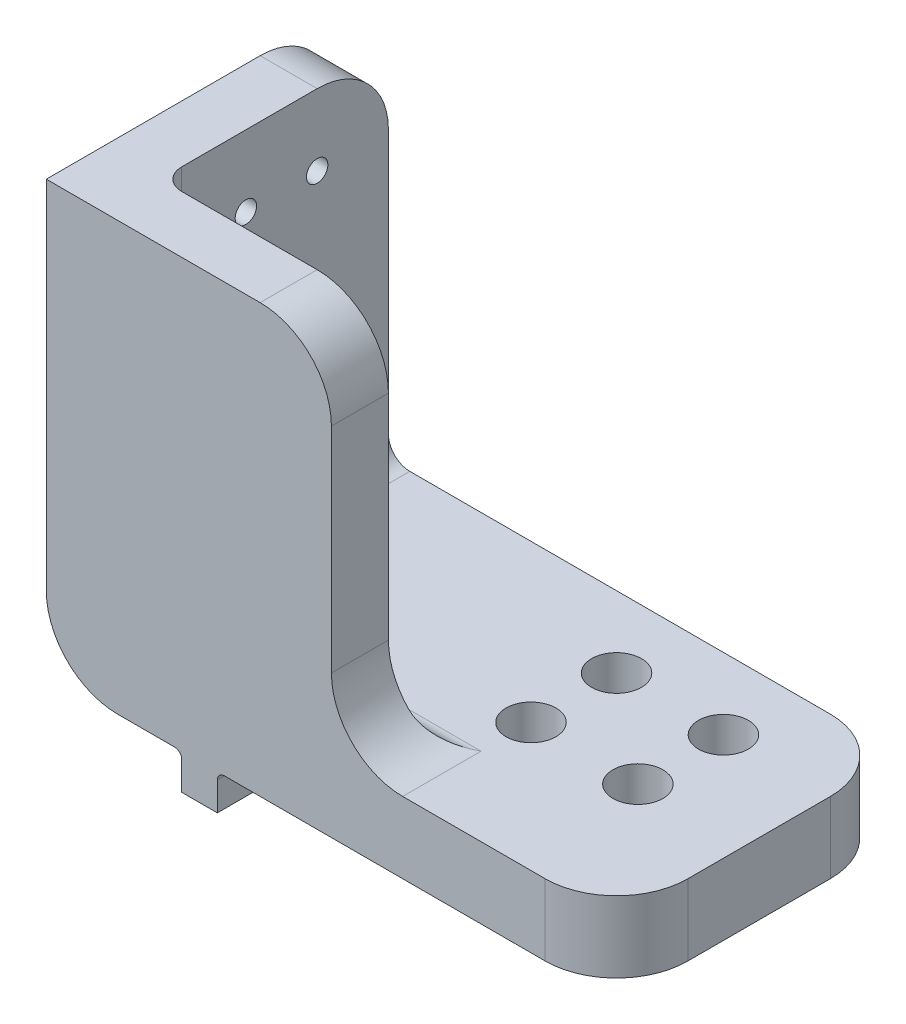
ISO-10303-21;
HEADER;
FILE_DESCRIPTION(('STEP AP214'),'2;1');
FILE_NAME('part.step','',(''),(''),'','','');
FILE_SCHEMA(('AUTOMOTIVE_DESIGN { 1 0 10303 214 1 1 1 1 }'));
ENDSEC;
DATA;
#1=APPLICATION_CONTEXT('core data for automotive mechanical design processes');
#2=APPLICATION_PROTOCOL_DEFINITION('international standard','automotive_design',2000,#1);
#3=PRODUCT_CONTEXT('',#1,'mechanical');
#4=PRODUCT('Part','Part','',(#3));
#5=PRODUCT_RELATED_PRODUCT_CATEGORY('part','',(#4));
#6=PRODUCT_DEFINITION_FORMATION('','',#4);
#7=PRODUCT_DEFINITION_CONTEXT('part definition',#1,'design');
#8=PRODUCT_DEFINITION('design','',#6,#7);
#9=PRODUCT_DEFINITION_SHAPE('','',#8);
#10=(LENGTH_UNIT() NAMED_UNIT(*) SI_UNIT(.MILLI.,.METRE.));
#11=(NAMED_UNIT(*) PLANE_ANGLE_UNIT() SI_UNIT($,.RADIAN.));
#12=(NAMED_UNIT(*) SI_UNIT($,.STERADIAN.) SOLID_ANGLE_UNIT());
#13=UNCERTAINTY_MEASURE_WITH_UNIT(LENGTH_MEASURE(1.E-05),#10,'distance_accuracy_value','');
#14=(GEOMETRIC_REPRESENTATION_CONTEXT(3) GLOBAL_UNCERTAINTY_ASSIGNED_CONTEXT((#13)) GLOBAL_UNIT_ASSIGNED_CONTEXT((#10,
#11,#12)) REPRESENTATION_CONTEXT('',''));
#15=CARTESIAN_POINT('',(0.,0.,0.));
#16=DIRECTION('',(0.,0.,1.));
#17=DIRECTION('',(1.,0.,0.));
#18=AXIS2_PLACEMENT_3D('',#15,#16,#17);
#19=CARTESIAN_POINT('',(0.,0.,0.));
#20=DIRECTION('',(0.,-1.,0.));
#21=DIRECTION('',(0.,0.,-1.));
#22=AXIS2_PLACEMENT_3D('',#19,#20,#21);
#23=PLANE('',#22);
#24=DIRECTION('',(-1.,0.,0.));
#25=VECTOR('',#24,1.);
#26=CARTESIAN_POINT('',(0.,0.,-40.));
#27=LINE('',#26,#25);
#28=CARTESIAN_POINT('',(18.,0.,-40.));
#29=VERTEX_POINT('',#28);
#30=CARTESIAN_POINT('',(10.,0.,-40.));
#31=VERTEX_POINT('',#30);
#32=EDGE_CURVE('E337',#29,#31,#27,.T.);
#33=ORIENTED_EDGE('',*,*,#32,.F.);
#34=DIRECTION('',(0.,0.,-1.));
#35=VECTOR('',#34,1.);
#36=CARTESIAN_POINT('',(18.,0.,0.));
#37=LINE('',#36,#35);
#38=CARTESIAN_POINT('',(18.,0.,0.));
#39=VERTEX_POINT('',#38);
#40=EDGE_CURVE('E69',#29,#39,#37,.F.);
#41=ORIENTED_EDGE('',*,*,#40,.T.);
#42=DIRECTION('',(1.,0.,0.));
#43=VECTOR('',#42,1.);
#44=CARTESIAN_POINT('',(0.,0.,0.));
#45=LINE('',#44,#43);
#46=CARTESIAN_POINT('',(10.,0.,0.));
#47=VERTEX_POINT('',#46);
#48=EDGE_CURVE('E330',#47,#39,#45,.T.);
#49=ORIENTED_EDGE('',*,*,#48,.F.);
#50=DIRECTION('',(0.,0.,1.));
#51=VECTOR('',#50,1.);
#52=CARTESIAN_POINT('',(10.,0.,-40.));
#53=LINE('',#52,#51);
#54=EDGE_CURVE('E563',#47,#31,#53,.F.);
#55=ORIENTED_EDGE('',*,*,#54,.T.);
#56=EDGE_LOOP('',(#33,#41,#49,#55));
#57=FACE_BOUND('',#56,.T.);
#58=ADVANCED_FACE('F51',(#57),#23,.T.);
#59=CARTESIAN_POINT('',(50.,0.,-18.));
#60=DIRECTION('',(0.,1.,0.));
#61=DIRECTION('',(0.,0.,1.));
#62=AXIS2_PLACEMENT_3D('',#59,#60,#61);
#63=CIRCLE('',#62,1.6);
#64=CARTESIAN_POINT('',(50.,0.,-16.4));
#65=VERTEX_POINT('',#64);
#66=EDGE_CURVE('E303',#65,#65,#63,.T.);
#67=ORIENTED_EDGE('',*,*,#66,.T.);
#68=EDGE_LOOP('',(#67));
#69=FACE_BOUND('',#68,.T.);
#70=CARTESIAN_POINT('',(65.,0.,-30.));
#71=DIRECTION('',(0.,1.,0.));
#72=DIRECTION('',(0.,0.,1.));
#73=AXIS2_PLACEMENT_3D('',#70,#71,#72);
#74=CIRCLE('',#73,1.6);
#75=CARTESIAN_POINT('',(65.,0.,-28.4));
#76=VERTEX_POINT('',#75);
#77=EDGE_CURVE('E311',#76,#76,#74,.T.);
#78=ORIENTED_EDGE('',*,*,#77,.T.);
#79=EDGE_LOOP('',(#78));
#80=FACE_BOUND('',#79,.T.);
#81=CARTESIAN_POINT('',(50.,0.,-30.));
#82=DIRECTION('',(0.,1.,0.));
#83=DIRECTION('',(0.,0.,1.));
#84=AXIS2_PLACEMENT_3D('',#81,#82,#83);
#85=CIRCLE('',#84,1.6);
#86=CARTESIAN_POINT('',(50.,0.,-28.4));
#87=VERTEX_POINT('',#86);
#88=EDGE_CURVE('E307',#87,#87,#85,.T.);
#89=ORIENTED_EDGE('',*,*,#88,.T.);
#90=EDGE_LOOP('',(#89));
#91=FACE_BOUND('',#90,.T.);
#92=CARTESIAN_POINT('',(65.,0.,-18.));
#93=DIRECTION('',(0.,1.,0.));
#94=DIRECTION('',(0.,0.,1.));
#95=AXIS2_PLACEMENT_3D('',#92,#93,#94);
#96=CIRCLE('',#95,1.6);
#97=CARTESIAN_POINT('',(65.,0.,-16.4));
#98=VERTEX_POINT('',#97);
#99=EDGE_CURVE('E299',#98,#98,#96,.T.);
#100=ORIENTED_EDGE('',*,*,#99,.T.);
#101=EDGE_LOOP('',(#100));
#102=FACE_BOUND('',#101,.T.);
#103=CARTESIAN_POINT('',(25.,0.,0.));
#104=VERTEX_POINT('',#103);
#105=CARTESIAN_POINT('',(70.,0.,0.));
#106=VERTEX_POINT('',#105);
#107=EDGE_CURVE('E315',#104,#106,#45,.T.);
#108=ORIENTED_EDGE('',*,*,#107,.F.);
#109=DIRECTION('',(0.,0.,1.));
#110=VECTOR('',#109,1.);
#111=CARTESIAN_POINT('',(25.,0.,0.));
#112=LINE('',#111,#110);
#113=CARTESIAN_POINT('',(25.,0.,-40.));
#114=VERTEX_POINT('',#113);
#115=EDGE_CURVE('E580',#104,#114,#112,.F.);
#116=ORIENTED_EDGE('',*,*,#115,.T.);
#117=CARTESIAN_POINT('',(70.,0.,-40.));
#118=VERTEX_POINT('',#117);
#119=EDGE_CURVE('E321',#118,#114,#27,.T.);
#120=ORIENTED_EDGE('',*,*,#119,.F.);
#121=CARTESIAN_POINT('',(70.,0.,-30.));
#122=DIRECTION('',(0.,-1.,0.));
#123=DIRECTION('',(0.,0.,-1.));
#124=AXIS2_PLACEMENT_3D('',#121,#122,#123);
#125=CIRCLE('',#124,10.);
#126=CARTESIAN_POINT('',(80.,0.,-30.));
#127=VERTEX_POINT('',#126);
#128=EDGE_CURVE('E388',#118,#127,#125,.T.);
#129=ORIENTED_EDGE('',*,*,#128,.T.);
#130=DIRECTION('',(0.,0.,-1.));
#131=VECTOR('',#130,1.);
#132=CARTESIAN_POINT('',(80.,0.,0.));
#133=LINE('',#132,#131);
#134=CARTESIAN_POINT('',(80.,0.,-10.));
#135=VERTEX_POINT('',#134);
#136=EDGE_CURVE('E333',#135,#127,#133,.T.);
#137=ORIENTED_EDGE('',*,*,#136,.F.);
#138=CARTESIAN_POINT('',(70.,0.,-10.));
#139=DIRECTION('',(0.,-1.,0.));
#140=DIRECTION('',(0.,0.,-1.));
#141=AXIS2_PLACEMENT_3D('',#138,#139,#140);
#142=CIRCLE('',#141,10.);
#143=EDGE_CURVE('E384',#135,#106,#142,.T.);
#144=ORIENTED_EDGE('',*,*,#143,.T.);
#145=EDGE_LOOP('',(#108,#116,#120,#129,#137,#144));
#146=FACE_BOUND('',#145,.T.);
#147=ADVANCED_FACE('F477',(#69,#80,#91,#102,#146),#23,.T.);
#148=CARTESIAN_POINT('',(65.,10.,-30.));
#149=DIRECTION('',(0.,-1.,0.));
#150=DIRECTION('',(0.,0.,-1.));
#151=AXIS2_PLACEMENT_3D('',#148,#149,#150);
#152=CYLINDRICAL_SURFACE('',#151,1.6);
#153=ORIENTED_EDGE('',*,*,#77,.F.);
#154=EDGE_LOOP('',(#153));
#155=FACE_BOUND('',#154,.T.);
#156=CARTESIAN_POINT('',(65.,5.,-30.));
#157=DIRECTION('',(0.,1.,0.));
#158=DIRECTION('',(0.,0.,1.));
#159=AXIS2_PLACEMENT_3D('',#156,#157,#158);
#160=CIRCLE('',#159,1.6);
#161=CARTESIAN_POINT('',(65.,5.,-28.4));
#162=VERTEX_POINT('',#161);
#163=EDGE_CURVE('E685',#162,#162,#160,.T.);
#164=ORIENTED_EDGE('',*,*,#163,.T.);
#165=EDGE_LOOP('',(#164));
#166=FACE_BOUND('',#165,.T.);
#167=ADVANCED_FACE('F482',(#155,#166),#152,.F.);
#168=CARTESIAN_POINT('',(50.,10.,-30.));
#169=DIRECTION('',(0.,-1.,0.));
#170=DIRECTION('',(0.,0.,-1.));
#171=AXIS2_PLACEMENT_3D('',#168,#169,#170);
#172=CYLINDRICAL_SURFACE('',#171,1.6);
#173=ORIENTED_EDGE('',*,*,#88,.F.);
#174=EDGE_LOOP('',(#173));
#175=FACE_BOUND('',#174,.T.);
#176=CARTESIAN_POINT('',(50.,5.,-30.));
#177=DIRECTION('',(0.,1.,0.));
#178=DIRECTION('',(0.,0.,1.));
#179=AXIS2_PLACEMENT_3D('',#176,#177,#178);
#180=CIRCLE('',#179,1.6);
#181=CARTESIAN_POINT('',(50.,5.,-28.4));
#182=VERTEX_POINT('',#181);
#183=EDGE_CURVE('E689',#182,#182,#180,.T.);
#184=ORIENTED_EDGE('',*,*,#183,.T.);
#185=EDGE_LOOP('',(#184));
#186=FACE_BOUND('',#185,.T.);
#187=ADVANCED_FACE('F798',(#175,#186),#172,.F.);
#188=CARTESIAN_POINT('',(50.,10.,-18.));
#189=DIRECTION('',(0.,-1.,0.));
#190=DIRECTION('',(0.,0.,-1.));
#191=AXIS2_PLACEMENT_3D('',#188,#189,#190);
#192=CYLINDRICAL_SURFACE('',#191,1.6);
#193=ORIENTED_EDGE('',*,*,#66,.F.);
#194=EDGE_LOOP('',(#193));
#195=FACE_BOUND('',#194,.T.);
#196=CARTESIAN_POINT('',(50.,5.,-18.));
#197=DIRECTION('',(0.,1.,0.));
#198=DIRECTION('',(0.,0.,1.));
#199=AXIS2_PLACEMENT_3D('',#196,#197,#198);
#200=CIRCLE('',#199,1.6);
#201=CARTESIAN_POINT('',(50.,5.,-16.4));
#202=VERTEX_POINT('',#201);
#203=EDGE_CURVE('E717',#202,#202,#200,.T.);
#204=ORIENTED_EDGE('',*,*,#203,.T.);
#205=EDGE_LOOP('',(#204));
#206=FACE_BOUND('',#205,.T.);
#207=ADVANCED_FACE('F794',(#195,#206),#192,.F.);
#208=CARTESIAN_POINT('',(65.,10.,-18.));
#209=DIRECTION('',(0.,-1.,0.));
#210=DIRECTION('',(0.,0.,-1.));
#211=AXIS2_PLACEMENT_3D('',#208,#209,#210);
#212=CYLINDRICAL_SURFACE('',#211,1.6);
#213=ORIENTED_EDGE('',*,*,#99,.F.);
#214=EDGE_LOOP('',(#213));
#215=FACE_BOUND('',#214,.T.);
#216=CARTESIAN_POINT('',(65.,5.,-18.));
#217=DIRECTION('',(0.,1.,0.));
#218=DIRECTION('',(0.,0.,1.));
#219=AXIS2_PLACEMENT_3D('',#216,#217,#218);
#220=CIRCLE('',#219,1.6);
#221=CARTESIAN_POINT('',(65.,5.,-16.4));
#222=VERTEX_POINT('',#221);
#223=EDGE_CURVE('E269',#222,#222,#220,.T.);
#224=ORIENTED_EDGE('',*,*,#223,.T.);
#225=EDGE_LOOP('',(#224));
#226=FACE_BOUND('',#225,.T.);
#227=ADVANCED_FACE('F743',(#215,#226),#212,.F.);
#228=CARTESIAN_POINT('',(0.,10.,0.));
#229=DIRECTION('',(0.,-1.,0.));
#230=DIRECTION('',(0.,0.,-1.));
#231=AXIS2_PLACEMENT_3D('',#228,#229,#230);
#232=PLANE('',#231);
#233=CARTESIAN_POINT('',(65.,10.,-30.));
#234=DIRECTION('',(0.,1.,0.));
#235=DIRECTION('',(0.,0.,1.));
#236=AXIS2_PLACEMENT_3D('',#233,#234,#235);
#237=CIRCLE('',#236,3.50000000000001);
#238=CARTESIAN_POINT('',(65.,10.,-26.5));
#239=VERTEX_POINT('',#238);
#240=EDGE_CURVE('E238',#239,#239,#237,.T.);
#241=ORIENTED_EDGE('',*,*,#240,.F.);
#242=EDGE_LOOP('',(#241));
#243=FACE_BOUND('',#242,.T.);
#244=CARTESIAN_POINT('',(65.,10.,-18.));
#245=DIRECTION('',(0.,1.,0.));
#246=DIRECTION('',(0.,0.,1.));
#247=AXIS2_PLACEMENT_3D('',#244,#245,#246);
#248=CIRCLE('',#247,3.50000000000001);
#249=CARTESIAN_POINT('',(65.,10.,-14.5));
#250=VERTEX_POINT('',#249);
#251=EDGE_CURVE('E254',#250,#250,#248,.T.);
#252=ORIENTED_EDGE('',*,*,#251,.F.);
#253=EDGE_LOOP('',(#252));
#254=FACE_BOUND('',#253,.T.);
#255=CARTESIAN_POINT('',(50.,10.,-18.));
#256=DIRECTION('',(0.,1.,0.));
#257=DIRECTION('',(0.,0.,1.));
#258=AXIS2_PLACEMENT_3D('',#255,#256,#257);
#259=CIRCLE('',#258,3.5);
#260=CARTESIAN_POINT('',(50.,10.,-14.5));
#261=VERTEX_POINT('',#260);
#262=EDGE_CURVE('E245',#261,#261,#259,.T.);
#263=ORIENTED_EDGE('',*,*,#262,.F.);
#264=EDGE_LOOP('',(#263));
#265=FACE_BOUND('',#264,.T.);
#266=CARTESIAN_POINT('',(50.,10.,-30.));
#267=DIRECTION('',(0.,1.,0.));
#268=DIRECTION('',(0.,0.,1.));
#269=AXIS2_PLACEMENT_3D('',#266,#267,#268);
#270=CIRCLE('',#269,3.5);
#271=CARTESIAN_POINT('',(50.,10.,-26.5));
#272=VERTEX_POINT('',#271);
#273=EDGE_CURVE('E249',#272,#272,#270,.T.);
#274=ORIENTED_EDGE('',*,*,#273,.F.);
#275=EDGE_LOOP('',(#274));
#276=FACE_BOUND('',#275,.T.);
#277=DIRECTION('',(-1.,0.,0.));
#278=VECTOR('',#277,1.);
#279=CARTESIAN_POINT('',(0.,10.,-40.));
#280=LINE('',#279,#278);
#281=CARTESIAN_POINT('',(70.,10.,-40.));
#282=VERTEX_POINT('',#281);
#283=CARTESIAN_POINT('',(11.,10.,-40.));
#284=VERTEX_POINT('',#283);
#285=EDGE_CURVE('E325',#282,#284,#280,.T.);
#286=ORIENTED_EDGE('',*,*,#285,.T.);
#287=DIRECTION('',(0.,0.,-1.));
#288=VECTOR('',#287,1.);
#289=CARTESIAN_POINT('',(11.,10.,-8.));
#290=LINE('',#289,#288);
#291=CARTESIAN_POINT('',(11.,10.,-11.));
#292=VERTEX_POINT('',#291);
#293=EDGE_CURVE('E430',#284,#292,#290,.F.);
#294=ORIENTED_EDGE('',*,*,#293,.T.);
#295=DIRECTION('',(1.,0.,0.));
#296=VECTOR('',#295,1.);
#297=CARTESIAN_POINT('',(0.,10.,-11.));
#298=LINE('',#297,#296);
#299=CARTESIAN_POINT('',(50.,10.,-11.));
#300=VERTEX_POINT('',#299);
#301=EDGE_CURVE('E426',#292,#300,#298,.T.);
#302=ORIENTED_EDGE('',*,*,#301,.T.);
#303=DIRECTION('',(0.,0.,-1.));
#304=VECTOR('',#303,1.);
#305=CARTESIAN_POINT('',(50.,10.,0.));
#306=LINE('',#305,#304);
#307=CARTESIAN_POINT('',(50.,10.,0.));
#308=VERTEX_POINT('',#307);
#309=EDGE_CURVE('E398',#300,#308,#306,.F.);
#310=ORIENTED_EDGE('',*,*,#309,.T.);
#311=DIRECTION('',(1.,0.,0.));
#312=VECTOR('',#311,1.);
#313=CARTESIAN_POINT('',(0.,10.,0.));
#314=LINE('',#313,#312);
#315=CARTESIAN_POINT('',(70.,10.,0.));
#316=VERTEX_POINT('',#315);
#317=EDGE_CURVE('E316',#308,#316,#314,.T.);
#318=ORIENTED_EDGE('',*,*,#317,.T.);
#319=CARTESIAN_POINT('',(70.,10.,-10.));
#320=DIRECTION('',(0.,-1.,0.));
#321=DIRECTION('',(0.,0.,-1.));
#322=AXIS2_PLACEMENT_3D('',#319,#320,#321);
#323=CIRCLE('',#322,10.);
#324=CARTESIAN_POINT('',(80.,10.,-10.));
#325=VERTEX_POINT('',#324);
#326=EDGE_CURVE('E401',#316,#325,#323,.F.);
#327=ORIENTED_EDGE('',*,*,#326,.T.);
#328=DIRECTION('',(0.,0.,-1.));
#329=VECTOR('',#328,1.);
#330=CARTESIAN_POINT('',(80.,10.,0.));
#331=LINE('',#330,#329);
#332=CARTESIAN_POINT('',(80.,10.,-30.));
#333=VERTEX_POINT('',#332);
#334=EDGE_CURVE('E320',#325,#333,#331,.T.);
#335=ORIENTED_EDGE('',*,*,#334,.T.);
#336=CARTESIAN_POINT('',(70.,10.,-30.));
#337=DIRECTION('',(0.,-1.,0.));
#338=DIRECTION('',(0.,0.,-1.));
#339=AXIS2_PLACEMENT_3D('',#336,#337,#338);
#340=CIRCLE('',#339,10.);
#341=EDGE_CURVE('E404',#333,#282,#340,.F.);
#342=ORIENTED_EDGE('',*,*,#341,.T.);
#343=EDGE_LOOP('',(#286,#294,#302,#310,#318,#327,#335,#342));
#344=FACE_BOUND('',#343,.T.);
#345=ADVANCED_FACE('F486',(#243,#254,#265,#276,#344),#232,.F.);
#346=CARTESIAN_POINT('',(0.,10.,0.));
#347=DIRECTION('',(1.,0.,0.));
#348=DIRECTION('',(0.,0.,-1.));
#349=AXIS2_PLACEMENT_3D('',#346,#347,#348);
#350=PLANE('',#349);
#351=CARTESIAN_POINT('',(0.,50.,-30.));
#352=DIRECTION('',(-1.,0.,0.));
#353=DIRECTION('',(0.,0.,1.));
#354=AXIS2_PLACEMENT_3D('',#351,#352,#353);
#355=CIRCLE('',#354,1.5);
#356=CARTESIAN_POINT('',(0.,50.,-28.5));
#357=VERTEX_POINT('',#356);
#358=EDGE_CURVE('E597',#357,#357,#355,.T.);
#359=ORIENTED_EDGE('',*,*,#358,.F.);
#360=EDGE_LOOP('',(#359));
#361=FACE_BOUND('',#360,.T.);
#362=CARTESIAN_POINT('',(0.,50.,-20.));
#363=DIRECTION('',(-1.,0.,0.));
#364=DIRECTION('',(0.,0.,1.));
#365=AXIS2_PLACEMENT_3D('',#362,#363,#364);
#366=CIRCLE('',#365,1.5);
#367=CARTESIAN_POINT('',(0.,50.,-18.5));
#368=VERTEX_POINT('',#367);
#369=EDGE_CURVE('E605',#368,#368,#366,.T.);
#370=ORIENTED_EDGE('',*,*,#369,.F.);
#371=EDGE_LOOP('',(#370));
#372=FACE_BOUND('',#371,.T.);
#373=DIRECTION('',(0.,-1.,0.));
#374=VECTOR('',#373,1.);
#375=CARTESIAN_POINT('',(0.,10.,-40.));
#376=LINE('',#375,#374);
#377=CARTESIAN_POINT('',(0.,50.,-40.));
#378=VERTEX_POINT('',#377);
#379=CARTESIAN_POINT('',(0.,10.,-40.));
#380=VERTEX_POINT('',#379);
#381=EDGE_CURVE('E329',#378,#380,#376,.T.);
#382=ORIENTED_EDGE('',*,*,#381,.T.);
#383=DIRECTION('',(0.,0.,1.));
#384=VECTOR('',#383,1.);
#385=CARTESIAN_POINT('',(0.,10.,0.));
#386=LINE('',#385,#384);
#387=CARTESIAN_POINT('',(0.,10.,0.));
#388=VERTEX_POINT('',#387);
#389=EDGE_CURVE('E448',#380,#388,#386,.T.);
#390=ORIENTED_EDGE('',*,*,#389,.T.);
#391=DIRECTION('',(0.,-1.,0.));
#392=VECTOR('',#391,1.);
#393=CARTESIAN_POINT('',(0.,10.,0.));
#394=LINE('',#393,#392);
#395=CARTESIAN_POINT('',(0.,60.,0.));
#396=VERTEX_POINT('',#395);
#397=EDGE_CURVE('E342',#396,#388,#394,.T.);
#398=ORIENTED_EDGE('',*,*,#397,.F.);
#399=DIRECTION('',(0.,0.,1.));
#400=VECTOR('',#399,1.);
#401=CARTESIAN_POINT('',(0.,60.,0.));
#402=LINE('',#401,#400);
#403=CARTESIAN_POINT('',(0.,60.,-30.));
#404=VERTEX_POINT('',#403);
#405=EDGE_CURVE('E273',#404,#396,#402,.T.);
#406=ORIENTED_EDGE('',*,*,#405,.F.);
#407=CARTESIAN_POINT('',(0.,50.,-30.));
#408=DIRECTION('',(1.,0.,0.));
#409=DIRECTION('',(0.,0.,-1.));
#410=AXIS2_PLACEMENT_3D('',#407,#408,#409);
#411=CIRCLE('',#410,10.);
#412=EDGE_CURVE('E354',#404,#378,#411,.F.);
#413=ORIENTED_EDGE('',*,*,#412,.T.);
#414=EDGE_LOOP('',(#382,#390,#398,#406,#413));
#415=FACE_BOUND('',#414,.T.);
#416=ADVANCED_FACE('F498',(#361,#372,#415),#350,.F.);
#417=CARTESIAN_POINT('',(0.,10.,0.));
#418=DIRECTION('',(0.,0.,-1.));
#419=DIRECTION('',(-1.,0.,0.));
#420=AXIS2_PLACEMENT_3D('',#417,#418,#419);
#421=PLANE('',#420);
#422=ORIENTED_EDGE('',*,*,#397,.T.);
#423=CARTESIAN_POINT('',(10.,10.,0.));
#424=DIRECTION('',(0.,0.,-1.));
#425=DIRECTION('',(-1.,0.,0.));
#426=AXIS2_PLACEMENT_3D('',#423,#424,#425);
#427=CIRCLE('',#426,10.);
#428=EDGE_CURVE('E558',#388,#47,#427,.F.);
#429=ORIENTED_EDGE('',*,*,#428,.T.);
#430=ORIENTED_EDGE('',*,*,#48,.T.);
#431=CARTESIAN_POINT('',(18.,-1.,0.));
#432=DIRECTION('',(0.,0.,-1.));
#433=DIRECTION('',(-1.,0.,0.));
#434=AXIS2_PLACEMENT_3D('',#431,#432,#433);
#435=CIRCLE('',#434,1.);
#436=CARTESIAN_POINT('',(19.,-1.,0.));
#437=VERTEX_POINT('',#436);
#438=EDGE_CURVE('E11',#39,#437,#435,.T.);
#439=ORIENTED_EDGE('',*,*,#438,.T.);
#440=DIRECTION('',(0.,1.,0.));
#441=VECTOR('',#440,1.);
#442=CARTESIAN_POINT('',(19.,-5.,0.));
#443=LINE('',#442,#441);
#444=CARTESIAN_POINT('',(19.,-5.,0.));
#445=VERTEX_POINT('',#444);
#446=EDGE_CURVE('E619',#445,#437,#443,.T.);
#447=ORIENTED_EDGE('',*,*,#446,.F.);
#448=DIRECTION('',(-1.,0.,0.));
#449=VECTOR('',#448,1.);
#450=CARTESIAN_POINT('',(19.,-5.,0.));
#451=LINE('',#450,#449);
#452=CARTESIAN_POINT('',(24.,-5.,0.));
#453=VERTEX_POINT('',#452);
#454=EDGE_CURVE('E220',#453,#445,#451,.T.);
#455=ORIENTED_EDGE('',*,*,#454,.F.);
#456=DIRECTION('',(0.,1.,0.));
#457=VECTOR('',#456,1.);
#458=CARTESIAN_POINT('',(24.,-5.,0.));
#459=LINE('',#458,#457);
#460=CARTESIAN_POINT('',(24.,-1.,0.));
#461=VERTEX_POINT('',#460);
#462=EDGE_CURVE('E241',#453,#461,#459,.T.);
#463=ORIENTED_EDGE('',*,*,#462,.T.);
#464=CARTESIAN_POINT('',(25.,-1.,0.));
#465=DIRECTION('',(0.,0.,-1.));
#466=DIRECTION('',(-1.,0.,0.));
#467=AXIS2_PLACEMENT_3D('',#464,#465,#466);
#468=CIRCLE('',#467,1.);
#469=EDGE_CURVE('E587',#461,#104,#468,.T.);
#470=ORIENTED_EDGE('',*,*,#469,.T.);
#471=ORIENTED_EDGE('',*,*,#107,.T.);
#472=DIRECTION('',(0.,-1.,0.));
#473=VECTOR('',#472,1.);
#474=CARTESIAN_POINT('',(70.,10.,0.));
#475=LINE('',#474,#473);
#476=EDGE_CURVE('E378',#106,#316,#475,.F.);
#477=ORIENTED_EDGE('',*,*,#476,.T.);
#478=ORIENTED_EDGE('',*,*,#317,.F.);
#479=CARTESIAN_POINT('',(50.,20.,0.));
#480=DIRECTION('',(0.,0.,-1.));
#481=DIRECTION('',(-1.,0.,0.));
#482=AXIS2_PLACEMENT_3D('',#479,#480,#481);
#483=CIRCLE('',#482,10.);
#484=CARTESIAN_POINT('',(40.,20.,0.));
#485=VERTEX_POINT('',#484);
#486=EDGE_CURVE('E411',#308,#485,#483,.T.);
#487=ORIENTED_EDGE('',*,*,#486,.T.);
#488=DIRECTION('',(0.,-1.,0.));
#489=VECTOR('',#488,1.);
#490=CARTESIAN_POINT('',(40.,60.,0.));
#491=LINE('',#490,#489);
#492=CARTESIAN_POINT('',(40.,50.,0.));
#493=VERTEX_POINT('',#492);
#494=EDGE_CURVE('E295',#493,#485,#491,.T.);
#495=ORIENTED_EDGE('',*,*,#494,.F.);
#496=CARTESIAN_POINT('',(30.,50.,0.));
#497=DIRECTION('',(0.,0.,-1.));
#498=DIRECTION('',(-1.,0.,0.));
#499=AXIS2_PLACEMENT_3D('',#496,#497,#498);
#500=CIRCLE('',#499,10.);
#501=CARTESIAN_POINT('',(30.,60.,0.));
#502=VERTEX_POINT('',#501);
#503=EDGE_CURVE('E381',#493,#502,#500,.F.);
#504=ORIENTED_EDGE('',*,*,#503,.T.);
#505=DIRECTION('',(1.,0.,0.));
#506=VECTOR('',#505,1.);
#507=CARTESIAN_POINT('',(0.,60.,0.));
#508=LINE('',#507,#506);
#509=EDGE_CURVE('E276',#396,#502,#508,.T.);
#510=ORIENTED_EDGE('',*,*,#509,.F.);
#511=EDGE_LOOP('',(#422,#429,#430,#439,#447,#455,#463,#470,#471,#477,#478,#487,#495,#504,#510));
#512=FACE_BOUND('',#511,.T.);
#513=ADVANCED_FACE('F494',(#512),#421,.F.);
#514=CARTESIAN_POINT('',(80.,10.,0.));
#515=DIRECTION('',(-1.,0.,0.));
#516=DIRECTION('',(0.,0.,1.));
#517=AXIS2_PLACEMENT_3D('',#514,#515,#516);
#518=PLANE('',#517);
#519=ORIENTED_EDGE('',*,*,#136,.T.);
#520=DIRECTION('',(0.,-1.,0.));
#521=VECTOR('',#520,1.);
#522=CARTESIAN_POINT('',(80.,10.,-30.));
#523=LINE('',#522,#521);
#524=EDGE_CURVE('E395',#127,#333,#523,.F.);
#525=ORIENTED_EDGE('',*,*,#524,.T.);
#526=ORIENTED_EDGE('',*,*,#334,.F.);
#527=DIRECTION('',(0.,-1.,0.));
#528=VECTOR('',#527,1.);
#529=CARTESIAN_POINT('',(80.,10.,-10.));
#530=LINE('',#529,#528);
#531=EDGE_CURVE('E391',#325,#135,#530,.T.);
#532=ORIENTED_EDGE('',*,*,#531,.T.);
#533=EDGE_LOOP('',(#519,#525,#526,#532));
#534=FACE_BOUND('',#533,.T.);
#535=ADVANCED_FACE('F491',(#534),#518,.F.);
#536=CARTESIAN_POINT('',(0.,10.,-40.));
#537=DIRECTION('',(0.,0.,1.));
#538=DIRECTION('',(1.,0.,0.));
#539=AXIS2_PLACEMENT_3D('',#536,#537,#538);
#540=PLANE('',#539);
#541=ORIENTED_EDGE('',*,*,#119,.T.);
#542=CARTESIAN_POINT('',(25.,-1.,-40.));
#543=DIRECTION('',(0.,0.,1.));
#544=DIRECTION('',(1.,0.,0.));
#545=AXIS2_PLACEMENT_3D('',#542,#543,#544);
#546=CIRCLE('',#545,1.);
#547=CARTESIAN_POINT('',(24.,-1.,-40.));
#548=VERTEX_POINT('',#547);
#549=EDGE_CURVE('E590',#114,#548,#546,.T.);
#550=ORIENTED_EDGE('',*,*,#549,.T.);
#551=DIRECTION('',(0.,1.,0.));
#552=VECTOR('',#551,1.);
#553=CARTESIAN_POINT('',(24.,-5.,-40.));
#554=LINE('',#553,#552);
#555=CARTESIAN_POINT('',(24.,-5.,-40.));
#556=VERTEX_POINT('',#555);
#557=EDGE_CURVE('E210',#556,#548,#554,.T.);
#558=ORIENTED_EDGE('',*,*,#557,.F.);
#559=DIRECTION('',(1.,0.,0.));
#560=VECTOR('',#559,1.);
#561=CARTESIAN_POINT('',(19.,-5.,-40.));
#562=LINE('',#561,#560);
#563=CARTESIAN_POINT('',(19.,-5.,-40.));
#564=VERTEX_POINT('',#563);
#565=EDGE_CURVE('E203',#564,#556,#562,.T.);
#566=ORIENTED_EDGE('',*,*,#565,.F.);
#567=DIRECTION('',(0.,1.,0.));
#568=VECTOR('',#567,1.);
#569=CARTESIAN_POINT('',(19.,-5.,-40.));
#570=LINE('',#569,#568);
#571=CARTESIAN_POINT('',(19.,-1.,-40.));
#572=VERTEX_POINT('',#571);
#573=EDGE_CURVE('E208',#564,#572,#570,.T.);
#574=ORIENTED_EDGE('',*,*,#573,.T.);
#575=CARTESIAN_POINT('',(18.,-1.,-40.));
#576=DIRECTION('',(0.,0.,1.));
#577=DIRECTION('',(1.,0.,0.));
#578=AXIS2_PLACEMENT_3D('',#575,#576,#577);
#579=CIRCLE('',#578,1.);
#580=EDGE_CURVE('E61',#572,#29,#579,.T.);
#581=ORIENTED_EDGE('',*,*,#580,.T.);
#582=ORIENTED_EDGE('',*,*,#32,.T.);
#583=CARTESIAN_POINT('',(10.,10.,-40.));
#584=DIRECTION('',(0.,0.,1.));
#585=DIRECTION('',(1.,0.,0.));
#586=AXIS2_PLACEMENT_3D('',#583,#584,#585);
#587=CIRCLE('',#586,10.);
#588=EDGE_CURVE('E568',#31,#380,#587,.F.);
#589=ORIENTED_EDGE('',*,*,#588,.T.);
#590=ORIENTED_EDGE('',*,*,#381,.F.);
#591=DIRECTION('',(-1.,0.,0.));
#592=VECTOR('',#591,1.);
#593=CARTESIAN_POINT('',(8.,50.,-40.));
#594=LINE('',#593,#592);
#595=CARTESIAN_POINT('',(8.,50.,-40.));
#596=VERTEX_POINT('',#595);
#597=EDGE_CURVE('E361',#378,#596,#594,.F.);
#598=ORIENTED_EDGE('',*,*,#597,.T.);
#599=DIRECTION('',(0.,-1.,0.));
#600=VECTOR('',#599,1.);
#601=CARTESIAN_POINT('',(8.,60.,-40.));
#602=LINE('',#601,#600);
#603=CARTESIAN_POINT('',(8.,13.,-40.));
#604=VERTEX_POINT('',#603);
#605=EDGE_CURVE('E287',#596,#604,#602,.T.);
#606=ORIENTED_EDGE('',*,*,#605,.T.);
#607=CARTESIAN_POINT('',(11.,13.,-40.));
#608=DIRECTION('',(0.,0.,1.));
#609=DIRECTION('',(1.,0.,0.));
#610=AXIS2_PLACEMENT_3D('',#607,#608,#609);
#611=CIRCLE('',#610,3.);
#612=EDGE_CURVE('E436',#604,#284,#611,.T.);
#613=ORIENTED_EDGE('',*,*,#612,.T.);
#614=ORIENTED_EDGE('',*,*,#285,.F.);
#615=DIRECTION('',(0.,-1.,0.));
#616=VECTOR('',#615,1.);
#617=CARTESIAN_POINT('',(70.,10.,-40.));
#618=LINE('',#617,#616);
#619=EDGE_CURVE('E357',#282,#118,#618,.T.);
#620=ORIENTED_EDGE('',*,*,#619,.T.);
#621=EDGE_LOOP('',(#541,#550,#558,#566,#574,#581,#582,#589,#590,#598,#606,#613,#614,#620));
#622=FACE_BOUND('',#621,.T.);
#623=ADVANCED_FACE('F206',(#622),#540,.F.);
#624=CARTESIAN_POINT('',(40.,60.,0.));
#625=DIRECTION('',(-1.,0.,0.));
#626=DIRECTION('',(0.,0.,1.));
#627=AXIS2_PLACEMENT_3D('',#624,#625,#626);
#628=PLANE('',#627);
#629=DIRECTION('',(0.,-1.,0.));
#630=VECTOR('',#629,1.);
#631=CARTESIAN_POINT('',(40.,60.,-8.));
#632=LINE('',#631,#630);
#633=CARTESIAN_POINT('',(40.,50.,-8.));
#634=VERTEX_POINT('',#633);
#635=CARTESIAN_POINT('',(40.,20.,-8.));
#636=VERTEX_POINT('',#635);
#637=EDGE_CURVE('E291',#634,#636,#632,.T.);
#638=ORIENTED_EDGE('',*,*,#637,.F.);
#639=DIRECTION('',(0.,0.,-1.));
#640=VECTOR('',#639,1.);
#641=CARTESIAN_POINT('',(40.,50.,0.));
#642=LINE('',#641,#640);
#643=EDGE_CURVE('E375',#634,#493,#642,.F.);
#644=ORIENTED_EDGE('',*,*,#643,.T.);
#645=ORIENTED_EDGE('',*,*,#494,.T.);
#646=DIRECTION('',(0.,0.,-1.));
#647=VECTOR('',#646,1.);
#648=CARTESIAN_POINT('',(40.,20.,-8.));
#649=LINE('',#648,#647);
#650=EDGE_CURVE('E371',#485,#636,#649,.T.);
#651=ORIENTED_EDGE('',*,*,#650,.T.);
#652=EDGE_LOOP('',(#638,#644,#645,#651));
#653=FACE_BOUND('',#652,.T.);
#654=ADVANCED_FACE('F490',(#653),#628,.F.);
#655=CARTESIAN_POINT('',(0.,60.,-8.));
#656=DIRECTION('',(0.,0.,-1.));
#657=DIRECTION('',(-1.,0.,0.));
#658=AXIS2_PLACEMENT_3D('',#655,#656,#657);
#659=PLANE('',#658);
#660=DIRECTION('',(1.,0.,0.));
#661=VECTOR('',#660,1.);
#662=CARTESIAN_POINT('',(0.,13.,-8.));
#663=LINE('',#662,#661);
#664=CARTESIAN_POINT('',(42.8585715714571,13.,-8.));
#665=VERTEX_POINT('',#664);
#666=CARTESIAN_POINT('',(11.,13.,-8.));
#667=VERTEX_POINT('',#666);
#668=EDGE_CURVE('E420',#665,#667,#663,.F.);
#669=ORIENTED_EDGE('',*,*,#668,.T.);
#670=DIRECTION('',(0.,-1.,0.));
#671=VECTOR('',#670,1.);
#672=CARTESIAN_POINT('',(11.,60.,-8.));
#673=LINE('',#672,#671);
#674=CARTESIAN_POINT('',(11.,60.,-8.));
#675=VERTEX_POINT('',#674);
#676=EDGE_CURVE('E423',#667,#675,#673,.F.);
#677=ORIENTED_EDGE('',*,*,#676,.T.);
#678=DIRECTION('',(1.,0.,0.));
#679=VECTOR('',#678,1.);
#680=CARTESIAN_POINT('',(0.,60.,-8.));
#681=LINE('',#680,#679);
#682=CARTESIAN_POINT('',(30.,60.,-8.));
#683=VERTEX_POINT('',#682);
#684=EDGE_CURVE('E281',#675,#683,#681,.T.);
#685=ORIENTED_EDGE('',*,*,#684,.T.);
#686=CARTESIAN_POINT('',(30.,50.,-8.));
#687=DIRECTION('',(0.,0.,-1.));
#688=DIRECTION('',(-1.,0.,0.));
#689=AXIS2_PLACEMENT_3D('',#686,#687,#688);
#690=CIRCLE('',#689,10.);
#691=EDGE_CURVE('E368',#683,#634,#690,.T.);
#692=ORIENTED_EDGE('',*,*,#691,.T.);
#693=ORIENTED_EDGE('',*,*,#637,.T.);
#694=CARTESIAN_POINT('',(50.,20.,-8.));
#695=DIRECTION('',(0.,0.,-1.));
#696=DIRECTION('',(-1.,0.,0.));
#697=AXIS2_PLACEMENT_3D('',#694,#695,#696);
#698=CIRCLE('',#697,10.);
#699=EDGE_CURVE('E407',#636,#665,#698,.F.);
#700=ORIENTED_EDGE('',*,*,#699,.T.);
#701=EDGE_LOOP('',(#669,#677,#685,#692,#693,#700));
#702=FACE_BOUND('',#701,.T.);
#703=ADVANCED_FACE('F541',(#702),#659,.T.);
#704=CARTESIAN_POINT('',(8.,60.,0.));
#705=DIRECTION('',(-1.,0.,0.));
#706=DIRECTION('',(0.,0.,1.));
#707=AXIS2_PLACEMENT_3D('',#704,#705,#706);
#708=PLANE('',#707);
#709=CARTESIAN_POINT('',(7.99999999999999,50.,-30.));
#710=DIRECTION('',(-1.,0.,0.));
#711=DIRECTION('',(0.,0.,1.));
#712=AXIS2_PLACEMENT_3D('',#709,#710,#711);
#713=CIRCLE('',#712,1.5);
#714=CARTESIAN_POINT('',(7.99999999999999,50.,-28.5));
#715=VERTEX_POINT('',#714);
#716=EDGE_CURVE('E55',#715,#715,#713,.T.);
#717=ORIENTED_EDGE('',*,*,#716,.T.);
#718=EDGE_LOOP('',(#717));
#719=FACE_BOUND('',#718,.T.);
#720=CARTESIAN_POINT('',(7.99999999999999,50.,-20.));
#721=DIRECTION('',(-1.,0.,0.));
#722=DIRECTION('',(0.,0.,1.));
#723=AXIS2_PLACEMENT_3D('',#720,#721,#722);
#724=CIRCLE('',#723,1.5);
#725=CARTESIAN_POINT('',(7.99999999999999,50.,-18.5));
#726=VERTEX_POINT('',#725);
#727=EDGE_CURVE('E594',#726,#726,#724,.T.);
#728=ORIENTED_EDGE('',*,*,#727,.T.);
#729=EDGE_LOOP('',(#728));
#730=FACE_BOUND('',#729,.T.);
#731=DIRECTION('',(0.,0.,-1.));
#732=VECTOR('',#731,1.);
#733=CARTESIAN_POINT('',(8.,60.,0.));
#734=LINE('',#733,#732);
#735=CARTESIAN_POINT('',(8.,60.,-11.));
#736=VERTEX_POINT('',#735);
#737=CARTESIAN_POINT('',(8.,60.,-30.));
#738=VERTEX_POINT('',#737);
#739=EDGE_CURVE('E284',#736,#738,#734,.T.);
#740=ORIENTED_EDGE('',*,*,#739,.F.);
#741=DIRECTION('',(0.,-1.,0.));
#742=VECTOR('',#741,1.);
#743=CARTESIAN_POINT('',(8.,60.,-11.));
#744=LINE('',#743,#742);
#745=CARTESIAN_POINT('',(8.,13.,-11.));
#746=VERTEX_POINT('',#745);
#747=EDGE_CURVE('E416',#736,#746,#744,.T.);
#748=ORIENTED_EDGE('',*,*,#747,.T.);
#749=DIRECTION('',(0.,0.,-1.));
#750=VECTOR('',#749,1.);
#751=CARTESIAN_POINT('',(8.,13.,-40.));
#752=LINE('',#751,#750);
#753=EDGE_CURVE('E414',#746,#604,#752,.T.);
#754=ORIENTED_EDGE('',*,*,#753,.T.);
#755=ORIENTED_EDGE('',*,*,#605,.F.);
#756=CARTESIAN_POINT('',(8.,50.,-30.));
#757=DIRECTION('',(-1.,0.,0.));
#758=DIRECTION('',(0.,0.,1.));
#759=AXIS2_PLACEMENT_3D('',#756,#757,#758);
#760=CIRCLE('',#759,10.);
#761=EDGE_CURVE('E364',#596,#738,#760,.F.);
#762=ORIENTED_EDGE('',*,*,#761,.T.);
#763=EDGE_LOOP('',(#740,#748,#754,#755,#762));
#764=FACE_BOUND('',#763,.T.);
#765=ADVANCED_FACE('F784',(#719,#730,#764),#708,.F.);
#766=CARTESIAN_POINT('',(0.,60.,0.));
#767=DIRECTION('',(0.,1.,0.));
#768=DIRECTION('',(0.,0.,1.));
#769=AXIS2_PLACEMENT_3D('',#766,#767,#768);
#770=PLANE('',#769);
#771=ORIENTED_EDGE('',*,*,#684,.F.);
#772=CARTESIAN_POINT('',(11.,60.,-11.));
#773=DIRECTION('',(0.,1.,0.));
#774=DIRECTION('',(0.,0.,1.));
#775=AXIS2_PLACEMENT_3D('',#772,#773,#774);
#776=CIRCLE('',#775,3.);
#777=EDGE_CURVE('E433',#675,#736,#776,.F.);
#778=ORIENTED_EDGE('',*,*,#777,.T.);
#779=ORIENTED_EDGE('',*,*,#739,.T.);
#780=DIRECTION('',(-1.,0.,0.));
#781=VECTOR('',#780,1.);
#782=CARTESIAN_POINT('',(0.,60.,-30.));
#783=LINE('',#782,#781);
#784=EDGE_CURVE('E350',#738,#404,#783,.T.);
#785=ORIENTED_EDGE('',*,*,#784,.T.);
#786=ORIENTED_EDGE('',*,*,#405,.T.);
#787=ORIENTED_EDGE('',*,*,#509,.T.);
#788=DIRECTION('',(0.,0.,-1.));
#789=VECTOR('',#788,1.);
#790=CARTESIAN_POINT('',(30.,60.,-8.));
#791=LINE('',#790,#789);
#792=EDGE_CURVE('E346',#502,#683,#791,.T.);
#793=ORIENTED_EDGE('',*,*,#792,.T.);
#794=EDGE_LOOP('',(#771,#778,#779,#785,#786,#787,#793));
#795=FACE_BOUND('',#794,.T.);
#796=ADVANCED_FACE('F507',(#795),#770,.T.);
#797=CARTESIAN_POINT('',(0.,50.,-30.));
#798=DIRECTION('',(1.,0.,0.));
#799=DIRECTION('',(0.,0.,-1.));
#800=AXIS2_PLACEMENT_3D('',#797,#798,#799);
#801=CYLINDRICAL_SURFACE('',#800,10.);
#802=ORIENTED_EDGE('',*,*,#761,.F.);
#803=ORIENTED_EDGE('',*,*,#597,.F.);
#804=ORIENTED_EDGE('',*,*,#412,.F.);
#805=ORIENTED_EDGE('',*,*,#784,.F.);
#806=EDGE_LOOP('',(#802,#803,#804,#805));
#807=FACE_BOUND('',#806,.T.);
#808=ADVANCED_FACE('F503',(#807),#801,.T.);
#809=CARTESIAN_POINT('',(30.,50.,0.));
#810=DIRECTION('',(0.,0.,1.));
#811=DIRECTION('',(1.,0.,0.));
#812=AXIS2_PLACEMENT_3D('',#809,#810,#811);
#813=CYLINDRICAL_SURFACE('',#812,10.);
#814=ORIENTED_EDGE('',*,*,#503,.F.);
#815=ORIENTED_EDGE('',*,*,#643,.F.);
#816=ORIENTED_EDGE('',*,*,#691,.F.);
#817=ORIENTED_EDGE('',*,*,#792,.F.);
#818=EDGE_LOOP('',(#814,#815,#816,#817));
#819=FACE_BOUND('',#818,.T.);
#820=ADVANCED_FACE('F506',(#819),#813,.T.);
#821=CARTESIAN_POINT('',(70.,10.,-30.));
#822=DIRECTION('',(0.,-1.,0.));
#823=DIRECTION('',(0.,0.,-1.));
#824=AXIS2_PLACEMENT_3D('',#821,#822,#823);
#825=CYLINDRICAL_SURFACE('',#824,10.);
#826=ORIENTED_EDGE('',*,*,#341,.F.);
#827=ORIENTED_EDGE('',*,*,#524,.F.);
#828=ORIENTED_EDGE('',*,*,#128,.F.);
#829=ORIENTED_EDGE('',*,*,#619,.F.);
#830=EDGE_LOOP('',(#826,#827,#828,#829));
#831=FACE_BOUND('',#830,.T.);
#832=ADVANCED_FACE('F510',(#831),#825,.T.);
#833=CARTESIAN_POINT('',(70.,10.,-10.));
#834=DIRECTION('',(0.,-1.,0.));
#835=DIRECTION('',(0.,0.,-1.));
#836=AXIS2_PLACEMENT_3D('',#833,#834,#835);
#837=CYLINDRICAL_SURFACE('',#836,10.);
#838=ORIENTED_EDGE('',*,*,#326,.F.);
#839=ORIENTED_EDGE('',*,*,#476,.F.);
#840=ORIENTED_EDGE('',*,*,#143,.F.);
#841=ORIENTED_EDGE('',*,*,#531,.F.);
#842=EDGE_LOOP('',(#838,#839,#840,#841));
#843=FACE_BOUND('',#842,.T.);
#844=ADVANCED_FACE('F461',(#843),#837,.T.);
#845=CARTESIAN_POINT('',(50.,20.,0.));
#846=DIRECTION('',(0.,0.,1.));
#847=DIRECTION('',(1.,0.,0.));
#848=AXIS2_PLACEMENT_3D('',#845,#846,#847);
#849=CYLINDRICAL_SURFACE('',#848,10.);
#850=ORIENTED_EDGE('',*,*,#486,.F.);
#851=ORIENTED_EDGE('',*,*,#309,.F.);
#852=CARTESIAN_POINT('',(42.8585715714571,13.,-8.));
#853=CARTESIAN_POINT('',(42.975945268731,12.880215381009,-8.00004042152425));
#854=CARTESIAN_POINT('',(43.0962580762209,12.7635360118452,-8.00716843855754));
#855=CARTESIAN_POINT('',(43.3416144200961,12.5371885550392,-8.03371973907886));
#856=CARTESIAN_POINT('',(43.4666484486945,12.427507459545,-8.0531194338388));
#857=CARTESIAN_POINT('',(43.719590590279,12.2164666437312,-8.1021226636968));
#858=CARTESIAN_POINT('',(43.8474617958828,12.1150397929088,-8.13163092052518));
#859=CARTESIAN_POINT('',(44.1065635232265,11.9195446473378,-8.19940606221683));
#860=CARTESIAN_POINT('',(44.2377961821007,11.8254811963443,-8.23767864849031));
#861=CARTESIAN_POINT('',(44.568228857181,11.6004081399187,-8.34232478772631));
#862=CARTESIAN_POINT('',(44.7691152654195,11.4739784402907,-8.41326165601375));
#863=CARTESIAN_POINT('',(45.1754865253322,11.2376159975628,-8.5681340696487));
#864=CARTESIAN_POINT('',(45.3809727036081,11.1276880859952,-8.65207340740866));
#865=CARTESIAN_POINT('',(45.7966468618263,10.9233396538952,-8.83066872310387));
#866=CARTESIAN_POINT('',(46.0068552738661,10.8290133130504,-8.92538434650148));
#867=CARTESIAN_POINT('',(46.4299223927675,10.6561907675972,-9.12282899338271));
#868=CARTESIAN_POINT('',(46.6427809430186,10.5776936322298,-9.22555754521234));
#869=CARTESIAN_POINT('',(47.1139123390633,10.4216958097982,-9.45863794415036));
#870=CARTESIAN_POINT('',(47.3726444022217,10.3476227222085,-9.59036803096966));
#871=CARTESIAN_POINT('',(47.8920775927087,10.2210329533713,-9.86002438350468));
#872=CARTESIAN_POINT('',(48.1527792738069,10.1685225831672,-9.99795245017861));
#873=CARTESIAN_POINT('',(48.9352264395732,10.0428623725772,-10.4168171176801));
#874=CARTESIAN_POINT('',(49.4593163604895,10.0009325707651,-10.703855565219));
#875=CARTESIAN_POINT('',(49.9883060109137,10.0000051332241,-10.993594944975));
#876=CARTESIAN_POINT('',(49.9941530674866,10.0000000053492,-10.9967975098699));
#877=CARTESIAN_POINT('',(50.,10.,-11.));
#878=B_SPLINE_CURVE_WITH_KNOTS('',3,(#852,#853,#854,#855,#856,#857,#858,#859,#860,#861,#862,
#863,#864,#865,#866,#867,#868,#869,#870,#871,#872,#873,#874,#875,#876,#877),.UNSPECIFIED.,.F.,
.F.,(4,2,2,2,2,2,2,2,2,2,2,2,4),(0.,0.502681257876983,1.00439918142213,1.50151265730819,
1.99895044094774,2.74102058337031,3.48330757333105,4.22992365575345,4.9764958242559,
5.87440692538567,6.77258064294565,8.56196658141677,8.58196658733393),.UNSPECIFIED.);
#879=EDGE_CURVE('E439',#300,#665,#878,.F.);
#880=ORIENTED_EDGE('',*,*,#879,.T.);
#881=ORIENTED_EDGE('',*,*,#699,.F.);
#882=ORIENTED_EDGE('',*,*,#650,.F.);
#883=EDGE_LOOP('',(#850,#851,#880,#881,#882));
#884=FACE_BOUND('',#883,.T.);
#885=ADVANCED_FACE('F455',(#884),#849,.F.);
#886=CARTESIAN_POINT('',(11.,13.,0.));
#887=DIRECTION('',(0.,0.,1.));
#888=DIRECTION('',(1.,0.,0.));
#889=AXIS2_PLACEMENT_3D('',#886,#887,#888);
#890=CYLINDRICAL_SURFACE('',#889,3.);
#891=ORIENTED_EDGE('',*,*,#612,.F.);
#892=ORIENTED_EDGE('',*,*,#753,.F.);
#893=CARTESIAN_POINT('',(11.,13.,-11.));
#894=DIRECTION('',(0.,0.,-1.));
#895=DIRECTION('',(-1.,0.,0.));
#896=AXIS2_PLACEMENT_3D('',#893,#894,#895);
#897=CIRCLE('',#896,3.);
#898=EDGE_CURVE('E277',#292,#746,#897,.T.);
#899=ORIENTED_EDGE('',*,*,#898,.F.);
#900=ORIENTED_EDGE('',*,*,#293,.F.);
#901=EDGE_LOOP('',(#891,#892,#899,#900));
#902=FACE_BOUND('',#901,.T.);
#903=ADVANCED_FACE('F460',(#902),#890,.F.);
#904=CARTESIAN_POINT('',(0.,13.,-11.));
#905=DIRECTION('',(1.,0.,0.));
#906=DIRECTION('',(0.,0.,-1.));
#907=AXIS2_PLACEMENT_3D('',#904,#905,#906);
#908=CYLINDRICAL_SURFACE('',#907,3.);
#909=ORIENTED_EDGE('',*,*,#879,.F.);
#910=ORIENTED_EDGE('',*,*,#301,.F.);
#911=CARTESIAN_POINT('',(11.,13.,-11.));
#912=DIRECTION('',(1.,0.,0.));
#913=DIRECTION('',(0.,0.,-1.));
#914=AXIS2_PLACEMENT_3D('',#911,#912,#913);
#915=CIRCLE('',#914,3.);
#916=EDGE_CURVE('E536',#667,#292,#915,.T.);
#917=ORIENTED_EDGE('',*,*,#916,.F.);
#918=ORIENTED_EDGE('',*,*,#668,.F.);
#919=EDGE_LOOP('',(#909,#910,#917,#918));
#920=FACE_BOUND('',#919,.T.);
#921=ADVANCED_FACE('F451',(#920),#908,.F.);
#922=CARTESIAN_POINT('',(11.,13.,-11.));
#923=DIRECTION('',(0.,-1.,0.));
#924=DIRECTION('',(0.,0.,-1.));
#925=AXIS2_PLACEMENT_3D('',#922,#923,#924);
#926=SPHERICAL_SURFACE('',#925,3.);
#927=ORIENTED_EDGE('',*,*,#916,.T.);
#928=ORIENTED_EDGE('',*,*,#898,.T.);
#929=CARTESIAN_POINT('',(11.,13.,-11.));
#930=DIRECTION('',(0.,1.,0.));
#931=DIRECTION('',(0.,0.,1.));
#932=AXIS2_PLACEMENT_3D('',#929,#930,#931);
#933=CIRCLE('',#932,3.);
#934=EDGE_CURVE('E449',#667,#746,#933,.F.);
#935=ORIENTED_EDGE('',*,*,#934,.F.);
#936=EDGE_LOOP('',(#927,#928,#935));
#937=FACE_BOUND('',#936,.T.);
#938=ADVANCED_FACE('F467',(#937),#926,.F.);
#939=CARTESIAN_POINT('',(11.,60.,-11.));
#940=DIRECTION('',(0.,-1.,0.));
#941=DIRECTION('',(0.,0.,-1.));
#942=AXIS2_PLACEMENT_3D('',#939,#940,#941);
#943=CYLINDRICAL_SURFACE('',#942,3.);
#944=ORIENTED_EDGE('',*,*,#777,.F.);
#945=ORIENTED_EDGE('',*,*,#676,.F.);
#946=ORIENTED_EDGE('',*,*,#934,.T.);
#947=ORIENTED_EDGE('',*,*,#747,.F.);
#948=EDGE_LOOP('',(#944,#945,#946,#947));
#949=FACE_BOUND('',#948,.T.);
#950=ADVANCED_FACE('F464',(#949),#943,.F.);
#951=CARTESIAN_POINT('',(65.,5.,-18.));
#952=DIRECTION('',(0.,1.,0.));
#953=DIRECTION('',(0.,0.,1.));
#954=AXIS2_PLACEMENT_3D('',#951,#952,#953);
#955=CYLINDRICAL_SURFACE('',#954,3.50000000000001);
#956=CARTESIAN_POINT('',(65.,5.,-18.));
#957=DIRECTION('',(0.,1.,0.));
#958=DIRECTION('',(0.,0.,1.));
#959=AXIS2_PLACEMENT_3D('',#956,#957,#958);
#960=CIRCLE('',#959,3.50000000000001);
#961=CARTESIAN_POINT('',(65.,5.,-14.5));
#962=VERTEX_POINT('',#961);
#963=EDGE_CURVE('E258',#962,#962,#960,.T.);
#964=ORIENTED_EDGE('',*,*,#963,.F.);
#965=EDGE_LOOP('',(#964));
#966=FACE_BOUND('',#965,.T.);
#967=ORIENTED_EDGE('',*,*,#251,.T.);
#968=EDGE_LOOP('',(#967));
#969=FACE_BOUND('',#968,.T.);
#970=ADVANCED_FACE('F466',(#966,#969),#955,.F.);
#971=CARTESIAN_POINT('',(65.,5.,-18.));
#972=DIRECTION('',(0.,1.,0.));
#973=DIRECTION('',(0.,0.,1.));
#974=AXIS2_PLACEMENT_3D('',#971,#972,#973);
#975=PLANE('',#974);
#976=ORIENTED_EDGE('',*,*,#223,.F.);
#977=EDGE_LOOP('',(#976));
#978=FACE_BOUND('',#977,.T.);
#979=ORIENTED_EDGE('',*,*,#963,.T.);
#980=EDGE_LOOP('',(#979));
#981=FACE_BOUND('',#980,.T.);
#982=ADVANCED_FACE('F745',(#978,#981),#975,.T.);
#983=CARTESIAN_POINT('',(50.,5.,-18.));
#984=DIRECTION('',(0.,1.,0.));
#985=DIRECTION('',(0.,0.,1.));
#986=AXIS2_PLACEMENT_3D('',#983,#984,#985);
#987=CYLINDRICAL_SURFACE('',#986,3.5);
#988=CARTESIAN_POINT('',(50.,5.,-18.));
#989=DIRECTION('',(0.,1.,0.));
#990=DIRECTION('',(0.,0.,1.));
#991=AXIS2_PLACEMENT_3D('',#988,#989,#990);
#992=CIRCLE('',#991,3.5);
#993=CARTESIAN_POINT('',(50.,5.,-14.5));
#994=VERTEX_POINT('',#993);
#995=EDGE_CURVE('E250',#994,#994,#992,.T.);
#996=ORIENTED_EDGE('',*,*,#995,.F.);
#997=EDGE_LOOP('',(#996));
#998=FACE_BOUND('',#997,.T.);
#999=ORIENTED_EDGE('',*,*,#262,.T.);
#1000=EDGE_LOOP('',(#999));
#1001=FACE_BOUND('',#1000,.T.);
#1002=ADVANCED_FACE('F748',(#998,#1001),#987,.F.);
#1003=CARTESIAN_POINT('',(50.,5.,-18.));
#1004=DIRECTION('',(0.,1.,0.));
#1005=DIRECTION('',(0.,0.,1.));
#1006=AXIS2_PLACEMENT_3D('',#1003,#1004,#1005);
#1007=PLANE('',#1006);
#1008=ORIENTED_EDGE('',*,*,#203,.F.);
#1009=EDGE_LOOP('',(#1008));
#1010=FACE_BOUND('',#1009,.T.);
#1011=ORIENTED_EDGE('',*,*,#995,.T.);
#1012=EDGE_LOOP('',(#1011));
#1013=FACE_BOUND('',#1012,.T.);
#1014=ADVANCED_FACE('F767',(#1010,#1013),#1007,.T.);
#1015=CARTESIAN_POINT('',(50.,5.,-30.));
#1016=DIRECTION('',(0.,1.,0.));
#1017=DIRECTION('',(0.,0.,1.));
#1018=AXIS2_PLACEMENT_3D('',#1015,#1016,#1017);
#1019=CYLINDRICAL_SURFACE('',#1018,3.5);
#1020=CARTESIAN_POINT('',(50.,5.,-30.));
#1021=DIRECTION('',(0.,1.,0.));
#1022=DIRECTION('',(0.,0.,1.));
#1023=AXIS2_PLACEMENT_3D('',#1020,#1021,#1022);
#1024=CIRCLE('',#1023,3.5);
#1025=CARTESIAN_POINT('',(50.,5.,-26.5));
#1026=VERTEX_POINT('',#1025);
#1027=EDGE_CURVE('E265',#1026,#1026,#1024,.T.);
#1028=ORIENTED_EDGE('',*,*,#1027,.F.);
#1029=EDGE_LOOP('',(#1028));
#1030=FACE_BOUND('',#1029,.T.);
#1031=ORIENTED_EDGE('',*,*,#273,.T.);
#1032=EDGE_LOOP('',(#1031));
#1033=FACE_BOUND('',#1032,.T.);
#1034=ADVANCED_FACE('F764',(#1030,#1033),#1019,.F.);
#1035=CARTESIAN_POINT('',(50.,5.,-30.));
#1036=DIRECTION('',(0.,1.,0.));
#1037=DIRECTION('',(0.,0.,1.));
#1038=AXIS2_PLACEMENT_3D('',#1035,#1036,#1037);
#1039=PLANE('',#1038);
#1040=ORIENTED_EDGE('',*,*,#183,.F.);
#1041=EDGE_LOOP('',(#1040));
#1042=FACE_BOUND('',#1041,.T.);
#1043=ORIENTED_EDGE('',*,*,#1027,.T.);
#1044=EDGE_LOOP('',(#1043));
#1045=FACE_BOUND('',#1044,.T.);
#1046=ADVANCED_FACE('F766',(#1042,#1045),#1039,.T.);
#1047=CARTESIAN_POINT('',(65.,5.,-30.));
#1048=DIRECTION('',(0.,1.,0.));
#1049=DIRECTION('',(0.,0.,1.));
#1050=AXIS2_PLACEMENT_3D('',#1047,#1048,#1049);
#1051=CYLINDRICAL_SURFACE('',#1050,3.50000000000001);
#1052=CARTESIAN_POINT('',(65.,5.,-30.));
#1053=DIRECTION('',(0.,1.,0.));
#1054=DIRECTION('',(0.,0.,1.));
#1055=AXIS2_PLACEMENT_3D('',#1052,#1053,#1054);
#1056=CIRCLE('',#1055,3.50000000000001);
#1057=CARTESIAN_POINT('',(65.,5.,-26.5));
#1058=VERTEX_POINT('',#1057);
#1059=EDGE_CURVE('E231',#1058,#1058,#1056,.T.);
#1060=ORIENTED_EDGE('',*,*,#1059,.F.);
#1061=EDGE_LOOP('',(#1060));
#1062=FACE_BOUND('',#1061,.T.);
#1063=ORIENTED_EDGE('',*,*,#240,.T.);
#1064=EDGE_LOOP('',(#1063));
#1065=FACE_BOUND('',#1064,.T.);
#1066=ADVANCED_FACE('F774',(#1062,#1065),#1051,.F.);
#1067=CARTESIAN_POINT('',(65.,5.,-30.));
#1068=DIRECTION('',(0.,1.,0.));
#1069=DIRECTION('',(0.,0.,1.));
#1070=AXIS2_PLACEMENT_3D('',#1067,#1068,#1069);
#1071=PLANE('',#1070);
#1072=ORIENTED_EDGE('',*,*,#163,.F.);
#1073=EDGE_LOOP('',(#1072));
#1074=FACE_BOUND('',#1073,.T.);
#1075=ORIENTED_EDGE('',*,*,#1059,.T.);
#1076=EDGE_LOOP('',(#1075));
#1077=FACE_BOUND('',#1076,.T.);
#1078=ADVANCED_FACE('F810',(#1074,#1077),#1071,.T.);
#1079=CARTESIAN_POINT('',(10.,10.,0.));
#1080=DIRECTION('',(0.,0.,-1.));
#1081=DIRECTION('',(-1.,0.,0.));
#1082=AXIS2_PLACEMENT_3D('',#1079,#1080,#1081);
#1083=CYLINDRICAL_SURFACE('',#1082,10.);
#1084=ORIENTED_EDGE('',*,*,#588,.F.);
#1085=ORIENTED_EDGE('',*,*,#54,.F.);
#1086=ORIENTED_EDGE('',*,*,#428,.F.);
#1087=ORIENTED_EDGE('',*,*,#389,.F.);
#1088=EDGE_LOOP('',(#1084,#1085,#1086,#1087));
#1089=FACE_BOUND('',#1088,.T.);
#1090=ADVANCED_FACE('F567',(#1089),#1083,.T.);
#1091=CARTESIAN_POINT('',(19.,-5.,0.));
#1092=DIRECTION('',(1.,0.,0.));
#1093=DIRECTION('',(0.,0.,-1.));
#1094=AXIS2_PLACEMENT_3D('',#1091,#1092,#1093);
#1095=PLANE('',#1094);
#1096=ORIENTED_EDGE('',*,*,#446,.T.);
#1097=DIRECTION('',(0.,0.,-1.));
#1098=VECTOR('',#1097,1.);
#1099=CARTESIAN_POINT('',(19.,-1.,0.));
#1100=LINE('',#1099,#1098);
#1101=EDGE_CURVE('E229',#437,#572,#1100,.T.);
#1102=ORIENTED_EDGE('',*,*,#1101,.T.);
#1103=ORIENTED_EDGE('',*,*,#573,.F.);
#1104=DIRECTION('',(0.,0.,-1.));
#1105=VECTOR('',#1104,1.);
#1106=CARTESIAN_POINT('',(19.,-5.,0.));
#1107=LINE('',#1106,#1105);
#1108=EDGE_CURVE('E215',#445,#564,#1107,.T.);
#1109=ORIENTED_EDGE('',*,*,#1108,.F.);
#1110=EDGE_LOOP('',(#1096,#1102,#1103,#1109));
#1111=FACE_BOUND('',#1110,.T.);
#1112=ADVANCED_FACE('F227',(#1111),#1095,.F.);
#1113=CARTESIAN_POINT('',(24.,-5.,0.));
#1114=DIRECTION('',(-1.,0.,0.));
#1115=DIRECTION('',(0.,0.,1.));
#1116=AXIS2_PLACEMENT_3D('',#1113,#1114,#1115);
#1117=PLANE('',#1116);
#1118=ORIENTED_EDGE('',*,*,#557,.T.);
#1119=DIRECTION('',(0.,0.,1.));
#1120=VECTOR('',#1119,1.);
#1121=CARTESIAN_POINT('',(24.,-1.,0.));
#1122=LINE('',#1121,#1120);
#1123=EDGE_CURVE('E573',#548,#461,#1122,.T.);
#1124=ORIENTED_EDGE('',*,*,#1123,.T.);
#1125=ORIENTED_EDGE('',*,*,#462,.F.);
#1126=DIRECTION('',(0.,0.,1.));
#1127=VECTOR('',#1126,1.);
#1128=CARTESIAN_POINT('',(24.,-5.,0.));
#1129=LINE('',#1128,#1127);
#1130=EDGE_CURVE('E214',#556,#453,#1129,.T.);
#1131=ORIENTED_EDGE('',*,*,#1130,.F.);
#1132=EDGE_LOOP('',(#1118,#1124,#1125,#1131));
#1133=FACE_BOUND('',#1132,.T.);
#1134=ADVANCED_FACE('F627',(#1133),#1117,.F.);
#1135=CARTESIAN_POINT('',(0.,-5.,0.));
#1136=DIRECTION('',(0.,-1.,0.));
#1137=DIRECTION('',(0.,0.,-1.));
#1138=AXIS2_PLACEMENT_3D('',#1135,#1136,#1137);
#1139=PLANE('',#1138);
#1140=ORIENTED_EDGE('',*,*,#1108,.T.);
#1141=ORIENTED_EDGE('',*,*,#565,.T.);
#1142=ORIENTED_EDGE('',*,*,#1130,.T.);
#1143=ORIENTED_EDGE('',*,*,#454,.T.);
#1144=EDGE_LOOP('',(#1140,#1141,#1142,#1143));
#1145=FACE_BOUND('',#1144,.T.);
#1146=ADVANCED_FACE('F218',(#1145),#1139,.T.);
#1147=CARTESIAN_POINT('',(25.,-1.,0.));
#1148=DIRECTION('',(0.,0.,1.));
#1149=DIRECTION('',(1.,0.,0.));
#1150=AXIS2_PLACEMENT_3D('',#1147,#1148,#1149);
#1151=CYLINDRICAL_SURFACE('',#1150,1.);
#1152=ORIENTED_EDGE('',*,*,#549,.F.);
#1153=ORIENTED_EDGE('',*,*,#115,.F.);
#1154=ORIENTED_EDGE('',*,*,#469,.F.);
#1155=ORIENTED_EDGE('',*,*,#1123,.F.);
#1156=EDGE_LOOP('',(#1152,#1153,#1154,#1155));
#1157=FACE_BOUND('',#1156,.T.);
#1158=ADVANCED_FACE('F631',(#1157),#1151,.F.);
#1159=CARTESIAN_POINT('',(18.,-1.,0.));
#1160=DIRECTION('',(0.,0.,-1.));
#1161=DIRECTION('',(-1.,0.,0.));
#1162=AXIS2_PLACEMENT_3D('',#1159,#1160,#1161);
#1163=CYLINDRICAL_SURFACE('',#1162,1.);
#1164=ORIENTED_EDGE('',*,*,#438,.F.);
#1165=ORIENTED_EDGE('',*,*,#40,.F.);
#1166=ORIENTED_EDGE('',*,*,#580,.F.);
#1167=ORIENTED_EDGE('',*,*,#1101,.F.);
#1168=EDGE_LOOP('',(#1164,#1165,#1166,#1167));
#1169=FACE_BOUND('',#1168,.T.);
#1170=ADVANCED_FACE('F53',(#1169),#1163,.F.);
#1171=CARTESIAN_POINT('',(80.,50.,-20.));
#1172=DIRECTION('',(-1.,0.,0.));
#1173=DIRECTION('',(0.,0.,1.));
#1174=AXIS2_PLACEMENT_3D('',#1171,#1172,#1173);
#1175=CYLINDRICAL_SURFACE('',#1174,1.5);
#1176=ORIENTED_EDGE('',*,*,#369,.T.);
#1177=EDGE_LOOP('',(#1176));
#1178=FACE_BOUND('',#1177,.T.);
#1179=ORIENTED_EDGE('',*,*,#727,.F.);
#1180=EDGE_LOOP('',(#1179));
#1181=FACE_BOUND('',#1180,.T.);
#1182=ADVANCED_FACE('F831',(#1178,#1181),#1175,.F.);
#1183=CARTESIAN_POINT('',(80.,50.,-30.));
#1184=DIRECTION('',(-1.,0.,0.));
#1185=DIRECTION('',(0.,0.,1.));
#1186=AXIS2_PLACEMENT_3D('',#1183,#1184,#1185);
#1187=CYLINDRICAL_SURFACE('',#1186,1.5);
#1188=ORIENTED_EDGE('',*,*,#358,.T.);
#1189=EDGE_LOOP('',(#1188));
#1190=FACE_BOUND('',#1189,.T.);
#1191=ORIENTED_EDGE('',*,*,#716,.F.);
#1192=EDGE_LOOP('',(#1191));
#1193=FACE_BOUND('',#1192,.T.);
#1194=ADVANCED_FACE('F834',(#1190,#1193),#1187,.F.);
#1195=CLOSED_SHELL('',(#58,#147,#167,#187,#207,#227,#345,#416,#513,#535,#623,#654,#703,#765,
#796,#808,#820,#832,#844,#885,#903,#921,#938,#950,#970,#982,#1002,#1014,#1034,#1046,#1066,#1078,
#1090,#1112,#1134,#1146,#1158,#1170,#1182,#1194));
#1196=MANIFOLD_SOLID_BREP('B2',#1195);
#1197=ADVANCED_BREP_SHAPE_REPRESENTATION('',(#18,#1196),#14);
#1198=SHAPE_DEFINITION_REPRESENTATION(#9,#1197);
ENDSEC;
END-ISO-10303-21;
